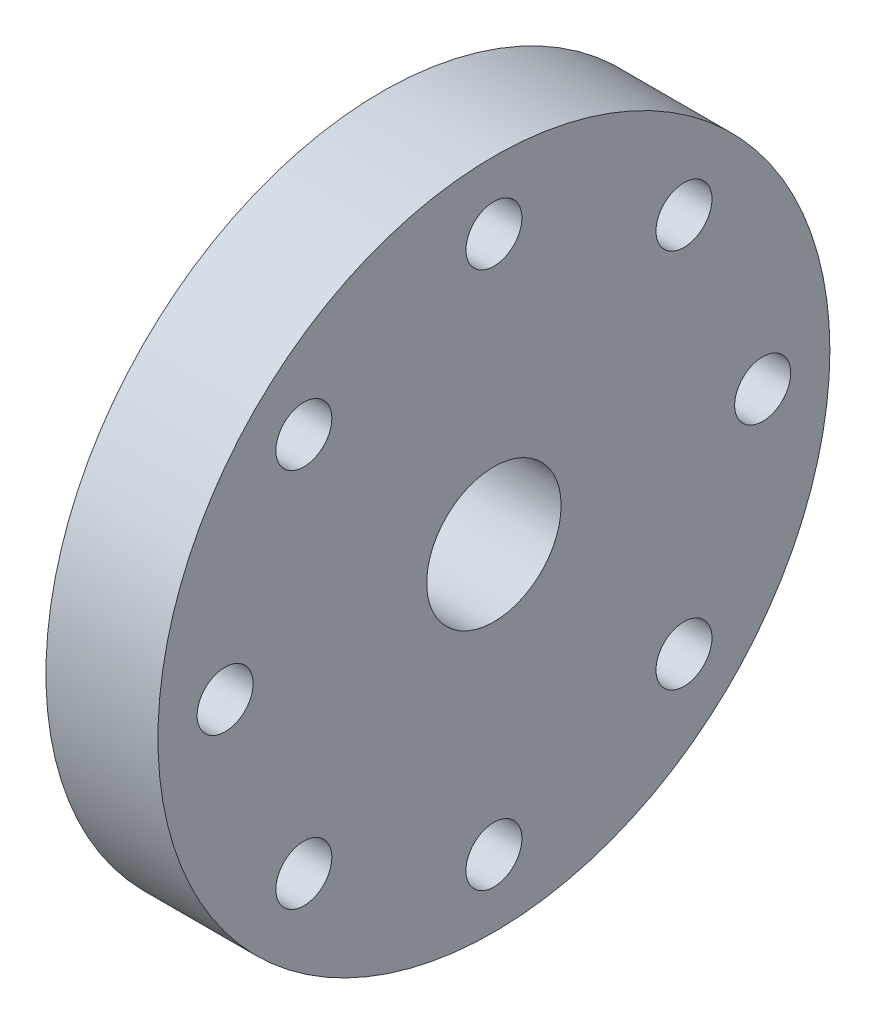
ISO-10303-21;
HEADER;
FILE_DESCRIPTION(('STEP AP214'),'2;1');
FILE_NAME('part.step','',(''),(''),'','','');
FILE_SCHEMA(('AUTOMOTIVE_DESIGN { 1 0 10303 214 1 1 1 1 }'));
ENDSEC;
DATA;
#1=APPLICATION_CONTEXT('core data for automotive mechanical design processes');
#2=APPLICATION_PROTOCOL_DEFINITION('international standard','automotive_design',2000,#1);
#3=PRODUCT_CONTEXT('',#1,'mechanical');
#4=PRODUCT('Part','Part','',(#3));
#5=PRODUCT_RELATED_PRODUCT_CATEGORY('part','',(#4));
#6=PRODUCT_DEFINITION_FORMATION('','',#4);
#7=PRODUCT_DEFINITION_CONTEXT('part definition',#1,'design');
#8=PRODUCT_DEFINITION('design','',#6,#7);
#9=PRODUCT_DEFINITION_SHAPE('','',#8);
#10=(LENGTH_UNIT() NAMED_UNIT(*) SI_UNIT(.MILLI.,.METRE.));
#11=(NAMED_UNIT(*) PLANE_ANGLE_UNIT() SI_UNIT($,.RADIAN.));
#12=(NAMED_UNIT(*) SI_UNIT($,.STERADIAN.) SOLID_ANGLE_UNIT());
#13=UNCERTAINTY_MEASURE_WITH_UNIT(LENGTH_MEASURE(1.E-05),#10,'distance_accuracy_value','');
#14=(GEOMETRIC_REPRESENTATION_CONTEXT(3) GLOBAL_UNCERTAINTY_ASSIGNED_CONTEXT((#13)) GLOBAL_UNIT_ASSIGNED_CONTEXT((#10,
#11,#12)) REPRESENTATION_CONTEXT('',''));
#15=CARTESIAN_POINT('',(0.,0.,0.));
#16=DIRECTION('',(0.,0.,1.));
#17=DIRECTION('',(1.,0.,0.));
#18=AXIS2_PLACEMENT_3D('',#15,#16,#17);
#19=CARTESIAN_POINT('',(5.,17.7094675493822,-27.2137763886259));
#20=DIRECTION('',(1.,0.,0.));
#21=DIRECTION('',(0.,0.,-1.));
#22=AXIS2_PLACEMENT_3D('',#19,#20,#21);
#23=PLANE('',#22);
#24=CARTESIAN_POINT('',(5.,17.7094675493822,-27.213776388625));
#25=DIRECTION('',(1.,0.,0.));
#26=DIRECTION('',(0.,0.,-1.));
#27=AXIS2_PLACEMENT_3D('',#24,#25,#26);
#28=CIRCLE('',#27,3.);
#29=CARTESIAN_POINT('',(5.,17.7094675493822,-30.213776388625));
#30=VERTEX_POINT('',#29);
#31=EDGE_CURVE('E103',#30,#30,#28,.T.);
#32=ORIENTED_EDGE('',*,*,#31,.F.);
#33=EDGE_LOOP('',(#32));
#34=FACE_BOUND('',#33,.T.);
#35=CARTESIAN_POINT('',(5.,9.22418617514194,-18.7284950143879));
#36=DIRECTION('',(1.,0.,0.));
#37=DIRECTION('',(0.,0.,-1.));
#38=AXIS2_PLACEMENT_3D('',#35,#36,#37);
#39=CIRCLE('',#38,1.2500000000002);
#40=CARTESIAN_POINT('',(5.,9.22418617514194,-19.9784950143881));
#41=VERTEX_POINT('',#40);
#42=EDGE_CURVE('E82',#41,#41,#39,.T.);
#43=ORIENTED_EDGE('',*,*,#42,.F.);
#44=EDGE_LOOP('',(#43));
#45=FACE_BOUND('',#44,.T.);
#46=CARTESIAN_POINT('',(5.,9.22418617514372,-35.6990577628661));
#47=DIRECTION('',(1.,0.,0.));
#48=DIRECTION('',(0.,0.,-1.));
#49=AXIS2_PLACEMENT_3D('',#46,#47,#48);
#50=CIRCLE('',#49,1.25000000000019);
#51=CARTESIAN_POINT('',(5.,9.22418617514372,-36.9490577628663));
#52=VERTEX_POINT('',#51);
#53=EDGE_CURVE('E70',#52,#52,#50,.T.);
#54=ORIENTED_EDGE('',*,*,#53,.F.);
#55=EDGE_LOOP('',(#54));
#56=FACE_BOUND('',#55,.T.);
#57=CARTESIAN_POINT('',(5.,26.1947489236201,-18.7284950143859));
#58=DIRECTION('',(1.,0.,0.));
#59=DIRECTION('',(0.,0.,-1.));
#60=AXIS2_PLACEMENT_3D('',#57,#58,#59);
#61=CIRCLE('',#60,1.2500000000002);
#62=CARTESIAN_POINT('',(5.,26.1947489236201,-19.9784950143861));
#63=VERTEX_POINT('',#62);
#64=EDGE_CURVE('E58',#63,#63,#61,.T.);
#65=ORIENTED_EDGE('',*,*,#64,.F.);
#66=EDGE_LOOP('',(#65));
#67=FACE_BOUND('',#66,.T.);
#68=CARTESIAN_POINT('',(5.,29.7094675493822,-27.213776388625));
#69=DIRECTION('',(1.,0.,0.));
#70=DIRECTION('',(0.,0.,-1.));
#71=AXIS2_PLACEMENT_3D('',#68,#69,#70);
#72=CIRCLE('',#71,1.2500000000002);
#73=CARTESIAN_POINT('',(5.,29.7094675493822,-28.4637763886252));
#74=VERTEX_POINT('',#73);
#75=EDGE_CURVE('E47',#74,#74,#72,.T.);
#76=ORIENTED_EDGE('',*,*,#75,.F.);
#77=EDGE_LOOP('',(#76));
#78=FACE_BOUND('',#77,.T.);
#79=CARTESIAN_POINT('',(5.,17.7094675493822,-27.2137763886259));
#80=DIRECTION('',(1.,0.,0.));
#81=DIRECTION('',(0.,0.,-1.));
#82=AXIS2_PLACEMENT_3D('',#79,#80,#81);
#83=CIRCLE('',#82,15.);
#84=CARTESIAN_POINT('',(5.,17.7094675493822,-42.2137763886259));
#85=VERTEX_POINT('',#84);
#86=EDGE_CURVE('E10',#85,#85,#83,.T.);
#87=ORIENTED_EDGE('',*,*,#86,.T.);
#88=EDGE_LOOP('',(#87));
#89=FACE_BOUND('',#88,.T.);
#90=CARTESIAN_POINT('',(5.,26.1947489236219,-35.6990577628641));
#91=DIRECTION('',(1.,0.,0.));
#92=DIRECTION('',(0.,0.,-1.));
#93=AXIS2_PLACEMENT_3D('',#90,#91,#92);
#94=CIRCLE('',#93,1.25000000000019);
#95=CARTESIAN_POINT('',(5.,26.1947489236219,-36.9490577628643));
#96=VERTEX_POINT('',#95);
#97=EDGE_CURVE('E52',#96,#96,#94,.T.);
#98=ORIENTED_EDGE('',*,*,#97,.F.);
#99=EDGE_LOOP('',(#98));
#100=FACE_BOUND('',#99,.T.);
#101=CARTESIAN_POINT('',(5.,17.7094675493804,-15.213776388625));
#102=DIRECTION('',(1.,0.,0.));
#103=DIRECTION('',(0.,0.,-1.));
#104=AXIS2_PLACEMENT_3D('',#101,#102,#103);
#105=CIRCLE('',#104,1.2500000000002);
#106=CARTESIAN_POINT('',(5.,17.7094675493804,-16.4637763886252));
#107=VERTEX_POINT('',#106);
#108=EDGE_CURVE('E64',#107,#107,#105,.T.);
#109=ORIENTED_EDGE('',*,*,#108,.F.);
#110=EDGE_LOOP('',(#109));
#111=FACE_BOUND('',#110,.T.);
#112=CARTESIAN_POINT('',(5.,17.7094675493839,-39.213776388627));
#113=DIRECTION('',(1.,0.,0.));
#114=DIRECTION('',(0.,0.,-1.));
#115=AXIS2_PLACEMENT_3D('',#112,#113,#114);
#116=CIRCLE('',#115,1.25000000000019);
#117=CARTESIAN_POINT('',(5.,17.7094675493839,-40.4637763886272));
#118=VERTEX_POINT('',#117);
#119=EDGE_CURVE('E76',#118,#118,#116,.T.);
#120=ORIENTED_EDGE('',*,*,#119,.F.);
#121=EDGE_LOOP('',(#120));
#122=FACE_BOUND('',#121,.T.);
#123=CARTESIAN_POINT('',(5.,5.70946754938214,-27.213776388627));
#124=DIRECTION('',(1.,0.,0.));
#125=DIRECTION('',(0.,0.,-1.));
#126=AXIS2_PLACEMENT_3D('',#123,#124,#125);
#127=CIRCLE('',#126,1.2500000000002);
#128=CARTESIAN_POINT('',(5.,5.70946754938214,-28.4637763886272));
#129=VERTEX_POINT('',#128);
#130=EDGE_CURVE('E88',#129,#129,#127,.T.);
#131=ORIENTED_EDGE('',*,*,#130,.F.);
#132=EDGE_LOOP('',(#131));
#133=FACE_BOUND('',#132,.T.);
#134=ADVANCED_FACE('F34',(#34,#45,#56,#67,#78,#89,#100,#111,#122,#133),#23,.T.);
#135=CARTESIAN_POINT('',(0.,17.7094675493822,-27.2137763886259));
#136=DIRECTION('',(1.,0.,0.));
#137=DIRECTION('',(0.,0.,-1.));
#138=AXIS2_PLACEMENT_3D('',#135,#136,#137);
#139=PLANE('',#138);
#140=CARTESIAN_POINT('',(0.,17.7094675493822,-27.213776388625));
#141=DIRECTION('',(1.,0.,0.));
#142=DIRECTION('',(0.,0.,-1.));
#143=AXIS2_PLACEMENT_3D('',#140,#141,#142);
#144=CIRCLE('',#143,5.);
#145=CARTESIAN_POINT('',(0.,17.7094675493822,-32.213776388625));
#146=VERTEX_POINT('',#145);
#147=EDGE_CURVE('E97',#146,#146,#144,.T.);
#148=ORIENTED_EDGE('',*,*,#147,.T.);
#149=EDGE_LOOP('',(#148));
#150=FACE_BOUND('',#149,.T.);
#151=CARTESIAN_POINT('',(0.,17.7094675493822,-27.2137763886259));
#152=DIRECTION('',(1.,0.,0.));
#153=DIRECTION('',(0.,0.,-1.));
#154=AXIS2_PLACEMENT_3D('',#151,#152,#153);
#155=CIRCLE('',#154,15.);
#156=CARTESIAN_POINT('',(0.,17.7094675493822,-42.2137763886259));
#157=VERTEX_POINT('',#156);
#158=EDGE_CURVE('E42',#157,#157,#155,.T.);
#159=ORIENTED_EDGE('',*,*,#158,.F.);
#160=EDGE_LOOP('',(#159));
#161=FACE_BOUND('',#160,.T.);
#162=CARTESIAN_POINT('',(0.,29.7094675493822,-27.213776388625));
#163=DIRECTION('',(1.,0.,0.));
#164=DIRECTION('',(0.,0.,-1.));
#165=AXIS2_PLACEMENT_3D('',#162,#163,#164);
#166=CIRCLE('',#165,1.2500000000002);
#167=CARTESIAN_POINT('',(0.,29.7094675493822,-28.4637763886252));
#168=VERTEX_POINT('',#167);
#169=EDGE_CURVE('E49',#168,#168,#166,.T.);
#170=ORIENTED_EDGE('',*,*,#169,.T.);
#171=EDGE_LOOP('',(#170));
#172=FACE_BOUND('',#171,.T.);
#173=CARTESIAN_POINT('',(0.,26.1947489236219,-35.6990577628641));
#174=DIRECTION('',(1.,0.,0.));
#175=DIRECTION('',(0.,0.,-1.));
#176=AXIS2_PLACEMENT_3D('',#173,#174,#175);
#177=CIRCLE('',#176,1.25000000000019);
#178=CARTESIAN_POINT('',(0.,26.1947489236219,-36.9490577628643));
#179=VERTEX_POINT('',#178);
#180=EDGE_CURVE('E55',#179,#179,#177,.T.);
#181=ORIENTED_EDGE('',*,*,#180,.T.);
#182=EDGE_LOOP('',(#181));
#183=FACE_BOUND('',#182,.T.);
#184=CARTESIAN_POINT('',(0.,26.1947489236201,-18.7284950143859));
#185=DIRECTION('',(1.,0.,0.));
#186=DIRECTION('',(0.,0.,-1.));
#187=AXIS2_PLACEMENT_3D('',#184,#185,#186);
#188=CIRCLE('',#187,1.2500000000002);
#189=CARTESIAN_POINT('',(0.,26.1947489236201,-19.9784950143861));
#190=VERTEX_POINT('',#189);
#191=EDGE_CURVE('E61',#190,#190,#188,.T.);
#192=ORIENTED_EDGE('',*,*,#191,.T.);
#193=EDGE_LOOP('',(#192));
#194=FACE_BOUND('',#193,.T.);
#195=CARTESIAN_POINT('',(0.,17.7094675493804,-15.213776388625));
#196=DIRECTION('',(1.,0.,0.));
#197=DIRECTION('',(0.,0.,-1.));
#198=AXIS2_PLACEMENT_3D('',#195,#196,#197);
#199=CIRCLE('',#198,1.2500000000002);
#200=CARTESIAN_POINT('',(0.,17.7094675493804,-16.4637763886252));
#201=VERTEX_POINT('',#200);
#202=EDGE_CURVE('E67',#201,#201,#199,.T.);
#203=ORIENTED_EDGE('',*,*,#202,.T.);
#204=EDGE_LOOP('',(#203));
#205=FACE_BOUND('',#204,.T.);
#206=CARTESIAN_POINT('',(0.,9.22418617514372,-35.6990577628661));
#207=DIRECTION('',(1.,0.,0.));
#208=DIRECTION('',(0.,0.,-1.));
#209=AXIS2_PLACEMENT_3D('',#206,#207,#208);
#210=CIRCLE('',#209,1.25000000000019);
#211=CARTESIAN_POINT('',(0.,9.22418617514372,-36.9490577628663));
#212=VERTEX_POINT('',#211);
#213=EDGE_CURVE('E73',#212,#212,#210,.T.);
#214=ORIENTED_EDGE('',*,*,#213,.T.);
#215=EDGE_LOOP('',(#214));
#216=FACE_BOUND('',#215,.T.);
#217=CARTESIAN_POINT('',(0.,17.7094675493839,-39.213776388627));
#218=DIRECTION('',(1.,0.,0.));
#219=DIRECTION('',(0.,0.,-1.));
#220=AXIS2_PLACEMENT_3D('',#217,#218,#219);
#221=CIRCLE('',#220,1.25000000000019);
#222=CARTESIAN_POINT('',(0.,17.7094675493839,-40.4637763886272));
#223=VERTEX_POINT('',#222);
#224=EDGE_CURVE('E79',#223,#223,#221,.T.);
#225=ORIENTED_EDGE('',*,*,#224,.T.);
#226=EDGE_LOOP('',(#225));
#227=FACE_BOUND('',#226,.T.);
#228=CARTESIAN_POINT('',(0.,9.22418617514194,-18.7284950143879));
#229=DIRECTION('',(1.,0.,0.));
#230=DIRECTION('',(0.,0.,-1.));
#231=AXIS2_PLACEMENT_3D('',#228,#229,#230);
#232=CIRCLE('',#231,1.2500000000002);
#233=CARTESIAN_POINT('',(0.,9.22418617514194,-19.9784950143881));
#234=VERTEX_POINT('',#233);
#235=EDGE_CURVE('E85',#234,#234,#232,.T.);
#236=ORIENTED_EDGE('',*,*,#235,.T.);
#237=EDGE_LOOP('',(#236));
#238=FACE_BOUND('',#237,.T.);
#239=CARTESIAN_POINT('',(0.,5.70946754938214,-27.213776388627));
#240=DIRECTION('',(1.,0.,0.));
#241=DIRECTION('',(0.,0.,-1.));
#242=AXIS2_PLACEMENT_3D('',#239,#240,#241);
#243=CIRCLE('',#242,1.2500000000002);
#244=CARTESIAN_POINT('',(0.,5.70946754938214,-28.4637763886272));
#245=VERTEX_POINT('',#244);
#246=EDGE_CURVE('E91',#245,#245,#243,.T.);
#247=ORIENTED_EDGE('',*,*,#246,.T.);
#248=EDGE_LOOP('',(#247));
#249=FACE_BOUND('',#248,.T.);
#250=ADVANCED_FACE('F127',(#150,#161,#172,#183,#194,#205,#216,#227,#238,#249),#139,.F.);
#251=CARTESIAN_POINT('',(5.,17.7094675493822,-27.2137763886259));
#252=DIRECTION('',(-1.,0.,0.));
#253=DIRECTION('',(0.,0.,1.));
#254=AXIS2_PLACEMENT_3D('',#251,#252,#253);
#255=CYLINDRICAL_SURFACE('',#254,15.);
#256=ORIENTED_EDGE('',*,*,#86,.F.);
#257=EDGE_LOOP('',(#256));
#258=FACE_BOUND('',#257,.T.);
#259=ORIENTED_EDGE('',*,*,#158,.T.);
#260=EDGE_LOOP('',(#259));
#261=FACE_BOUND('',#260,.T.);
#262=ADVANCED_FACE('F36',(#258,#261),#255,.T.);
#263=CARTESIAN_POINT('',(5.,29.7094675493822,-27.213776388625));
#264=DIRECTION('',(-1.,0.,0.));
#265=DIRECTION('',(0.,0.,1.));
#266=AXIS2_PLACEMENT_3D('',#263,#264,#265);
#267=CYLINDRICAL_SURFACE('',#266,1.2500000000002);
#268=ORIENTED_EDGE('',*,*,#75,.T.);
#269=EDGE_LOOP('',(#268));
#270=FACE_BOUND('',#269,.T.);
#271=ORIENTED_EDGE('',*,*,#169,.F.);
#272=EDGE_LOOP('',(#271));
#273=FACE_BOUND('',#272,.T.);
#274=ADVANCED_FACE('F137',(#270,#273),#267,.F.);
#275=CARTESIAN_POINT('',(5.,26.1947489236219,-35.6990577628641));
#276=DIRECTION('',(-1.,0.,0.));
#277=DIRECTION('',(0.,0.,1.));
#278=AXIS2_PLACEMENT_3D('',#275,#276,#277);
#279=CYLINDRICAL_SURFACE('',#278,1.25000000000019);
#280=ORIENTED_EDGE('',*,*,#97,.T.);
#281=EDGE_LOOP('',(#280));
#282=FACE_BOUND('',#281,.T.);
#283=ORIENTED_EDGE('',*,*,#180,.F.);
#284=EDGE_LOOP('',(#283));
#285=FACE_BOUND('',#284,.T.);
#286=ADVANCED_FACE('F140',(#282,#285),#279,.F.);
#287=CARTESIAN_POINT('',(5.,26.1947489236201,-18.7284950143859));
#288=DIRECTION('',(-1.,0.,0.));
#289=DIRECTION('',(0.,0.,1.));
#290=AXIS2_PLACEMENT_3D('',#287,#288,#289);
#291=CYLINDRICAL_SURFACE('',#290,1.2500000000002);
#292=ORIENTED_EDGE('',*,*,#64,.T.);
#293=EDGE_LOOP('',(#292));
#294=FACE_BOUND('',#293,.T.);
#295=ORIENTED_EDGE('',*,*,#191,.F.);
#296=EDGE_LOOP('',(#295));
#297=FACE_BOUND('',#296,.T.);
#298=ADVANCED_FACE('F144',(#294,#297),#291,.F.);
#299=CARTESIAN_POINT('',(5.,17.7094675493804,-15.213776388625));
#300=DIRECTION('',(-1.,0.,0.));
#301=DIRECTION('',(0.,0.,1.));
#302=AXIS2_PLACEMENT_3D('',#299,#300,#301);
#303=CYLINDRICAL_SURFACE('',#302,1.2500000000002);
#304=ORIENTED_EDGE('',*,*,#108,.T.);
#305=EDGE_LOOP('',(#304));
#306=FACE_BOUND('',#305,.T.);
#307=ORIENTED_EDGE('',*,*,#202,.F.);
#308=EDGE_LOOP('',(#307));
#309=FACE_BOUND('',#308,.T.);
#310=ADVANCED_FACE('F148',(#306,#309),#303,.F.);
#311=CARTESIAN_POINT('',(5.,9.22418617514372,-35.6990577628661));
#312=DIRECTION('',(-1.,0.,0.));
#313=DIRECTION('',(0.,0.,1.));
#314=AXIS2_PLACEMENT_3D('',#311,#312,#313);
#315=CYLINDRICAL_SURFACE('',#314,1.25000000000019);
#316=ORIENTED_EDGE('',*,*,#53,.T.);
#317=EDGE_LOOP('',(#316));
#318=FACE_BOUND('',#317,.T.);
#319=ORIENTED_EDGE('',*,*,#213,.F.);
#320=EDGE_LOOP('',(#319));
#321=FACE_BOUND('',#320,.T.);
#322=ADVANCED_FACE('F152',(#318,#321),#315,.F.);
#323=CARTESIAN_POINT('',(5.,17.7094675493839,-39.213776388627));
#324=DIRECTION('',(-1.,0.,0.));
#325=DIRECTION('',(0.,0.,1.));
#326=AXIS2_PLACEMENT_3D('',#323,#324,#325);
#327=CYLINDRICAL_SURFACE('',#326,1.25000000000019);
#328=ORIENTED_EDGE('',*,*,#119,.T.);
#329=EDGE_LOOP('',(#328));
#330=FACE_BOUND('',#329,.T.);
#331=ORIENTED_EDGE('',*,*,#224,.F.);
#332=EDGE_LOOP('',(#331));
#333=FACE_BOUND('',#332,.T.);
#334=ADVANCED_FACE('F156',(#330,#333),#327,.F.);
#335=CARTESIAN_POINT('',(5.,9.22418617514194,-18.7284950143879));
#336=DIRECTION('',(-1.,0.,0.));
#337=DIRECTION('',(0.,0.,1.));
#338=AXIS2_PLACEMENT_3D('',#335,#336,#337);
#339=CYLINDRICAL_SURFACE('',#338,1.2500000000002);
#340=ORIENTED_EDGE('',*,*,#42,.T.);
#341=EDGE_LOOP('',(#340));
#342=FACE_BOUND('',#341,.T.);
#343=ORIENTED_EDGE('',*,*,#235,.F.);
#344=EDGE_LOOP('',(#343));
#345=FACE_BOUND('',#344,.T.);
#346=ADVANCED_FACE('F160',(#342,#345),#339,.F.);
#347=CARTESIAN_POINT('',(5.,5.70946754938214,-27.213776388627));
#348=DIRECTION('',(-1.,0.,0.));
#349=DIRECTION('',(0.,0.,1.));
#350=AXIS2_PLACEMENT_3D('',#347,#348,#349);
#351=CYLINDRICAL_SURFACE('',#350,1.2500000000002);
#352=ORIENTED_EDGE('',*,*,#130,.T.);
#353=EDGE_LOOP('',(#352));
#354=FACE_BOUND('',#353,.T.);
#355=ORIENTED_EDGE('',*,*,#246,.F.);
#356=EDGE_LOOP('',(#355));
#357=FACE_BOUND('',#356,.T.);
#358=ADVANCED_FACE('F164',(#354,#357),#351,.F.);
#359=CARTESIAN_POINT('',(-1.,17.7094675493822,-27.213776388625));
#360=DIRECTION('',(1.,0.,0.));
#361=DIRECTION('',(0.,0.,-1.));
#362=AXIS2_PLACEMENT_3D('',#359,#360,#361);
#363=CYLINDRICAL_SURFACE('',#362,5.);
#364=CARTESIAN_POINT('',(-1.,17.7094675493822,-27.213776388625));
#365=DIRECTION('',(1.,0.,0.));
#366=DIRECTION('',(0.,0.,-1.));
#367=AXIS2_PLACEMENT_3D('',#364,#365,#366);
#368=CIRCLE('',#367,5.);
#369=CARTESIAN_POINT('',(-1.,17.7094675493822,-32.213776388625));
#370=VERTEX_POINT('',#369);
#371=EDGE_CURVE('E94',#370,#370,#368,.T.);
#372=ORIENTED_EDGE('',*,*,#371,.T.);
#373=EDGE_LOOP('',(#372));
#374=FACE_BOUND('',#373,.T.);
#375=ORIENTED_EDGE('',*,*,#147,.F.);
#376=EDGE_LOOP('',(#375));
#377=FACE_BOUND('',#376,.T.);
#378=ADVANCED_FACE('F168',(#374,#377),#363,.T.);
#379=CARTESIAN_POINT('',(-1.,17.7094675493822,-27.213776388625));
#380=DIRECTION('',(1.,0.,0.));
#381=DIRECTION('',(0.,0.,-1.));
#382=AXIS2_PLACEMENT_3D('',#379,#380,#381);
#383=PLANE('',#382);
#384=CARTESIAN_POINT('',(-1.,17.7094675493822,-27.213776388625));
#385=DIRECTION('',(1.,0.,0.));
#386=DIRECTION('',(0.,0.,-1.));
#387=AXIS2_PLACEMENT_3D('',#384,#385,#386);
#388=CIRCLE('',#387,1.5);
#389=CARTESIAN_POINT('',(-1.,17.7094675493822,-28.713776388625));
#390=VERTEX_POINT('',#389);
#391=EDGE_CURVE('E106',#390,#390,#388,.F.);
#392=ORIENTED_EDGE('',*,*,#391,.F.);
#393=EDGE_LOOP('',(#392));
#394=FACE_BOUND('',#393,.T.);
#395=ORIENTED_EDGE('',*,*,#371,.F.);
#396=EDGE_LOOP('',(#395));
#397=FACE_BOUND('',#396,.T.);
#398=ADVANCED_FACE('F172',(#394,#397),#383,.F.);
#399=CARTESIAN_POINT('',(-0.5,17.7094675493822,-27.213776388625));
#400=DIRECTION('',(1.,0.,0.));
#401=DIRECTION('',(0.,0.,-1.));
#402=AXIS2_PLACEMENT_3D('',#399,#400,#401);
#403=CYLINDRICAL_SURFACE('',#402,3.);
#404=CARTESIAN_POINT('',(-0.5,17.7094675493822,-27.213776388625));
#405=DIRECTION('',(1.,0.,0.));
#406=DIRECTION('',(0.,0.,-1.));
#407=AXIS2_PLACEMENT_3D('',#404,#405,#406);
#408=CIRCLE('',#407,3.);
#409=CARTESIAN_POINT('',(-0.5,17.7094675493822,-30.213776388625));
#410=VERTEX_POINT('',#409);
#411=EDGE_CURVE('E100',#410,#410,#408,.T.);
#412=ORIENTED_EDGE('',*,*,#411,.F.);
#413=EDGE_LOOP('',(#412));
#414=FACE_BOUND('',#413,.T.);
#415=ORIENTED_EDGE('',*,*,#31,.T.);
#416=EDGE_LOOP('',(#415));
#417=FACE_BOUND('',#416,.T.);
#418=ADVANCED_FACE('F124',(#414,#417),#403,.F.);
#419=CARTESIAN_POINT('',(-0.5,17.7094675493822,-27.213776388625));
#420=DIRECTION('',(1.,0.,0.));
#421=DIRECTION('',(0.,0.,-1.));
#422=AXIS2_PLACEMENT_3D('',#419,#420,#421);
#423=PLANE('',#422);
#424=CARTESIAN_POINT('',(-0.5,17.7094675493822,-27.213776388625));
#425=DIRECTION('',(1.,0.,0.));
#426=DIRECTION('',(0.,0.,-1.));
#427=AXIS2_PLACEMENT_3D('',#424,#425,#426);
#428=CIRCLE('',#427,1.5);
#429=CARTESIAN_POINT('',(-0.5,17.7094675493822,-28.713776388625));
#430=VERTEX_POINT('',#429);
#431=EDGE_CURVE('E38',#430,#430,#428,.F.);
#432=ORIENTED_EDGE('',*,*,#431,.T.);
#433=EDGE_LOOP('',(#432));
#434=FACE_BOUND('',#433,.T.);
#435=ORIENTED_EDGE('',*,*,#411,.T.);
#436=EDGE_LOOP('',(#435));
#437=FACE_BOUND('',#436,.T.);
#438=ADVANCED_FACE('F115',(#434,#437),#423,.T.);
#439=CARTESIAN_POINT('',(-78.,17.7094675493822,-27.213776388625));
#440=DIRECTION('',(1.,0.,0.));
#441=DIRECTION('',(0.,0.,-1.));
#442=AXIS2_PLACEMENT_3D('',#439,#440,#441);
#443=CYLINDRICAL_SURFACE('',#442,1.5);
#444=ORIENTED_EDGE('',*,*,#431,.F.);
#445=EDGE_LOOP('',(#444));
#446=FACE_BOUND('',#445,.T.);
#447=ORIENTED_EDGE('',*,*,#391,.T.);
#448=EDGE_LOOP('',(#447));
#449=FACE_BOUND('',#448,.T.);
#450=ADVANCED_FACE('F118',(#446,#449),#443,.F.);
#451=CLOSED_SHELL('',(#134,#250,#262,#274,#286,#298,#310,#322,#334,#346,#358,#378,#398,#418,
#438,#450));
#452=MANIFOLD_SOLID_BREP('B2',#451);
#453=ADVANCED_BREP_SHAPE_REPRESENTATION('',(#18,#452),#14);
#454=SHAPE_DEFINITION_REPRESENTATION(#9,#453);
ENDSEC;
END-ISO-10303-21;
